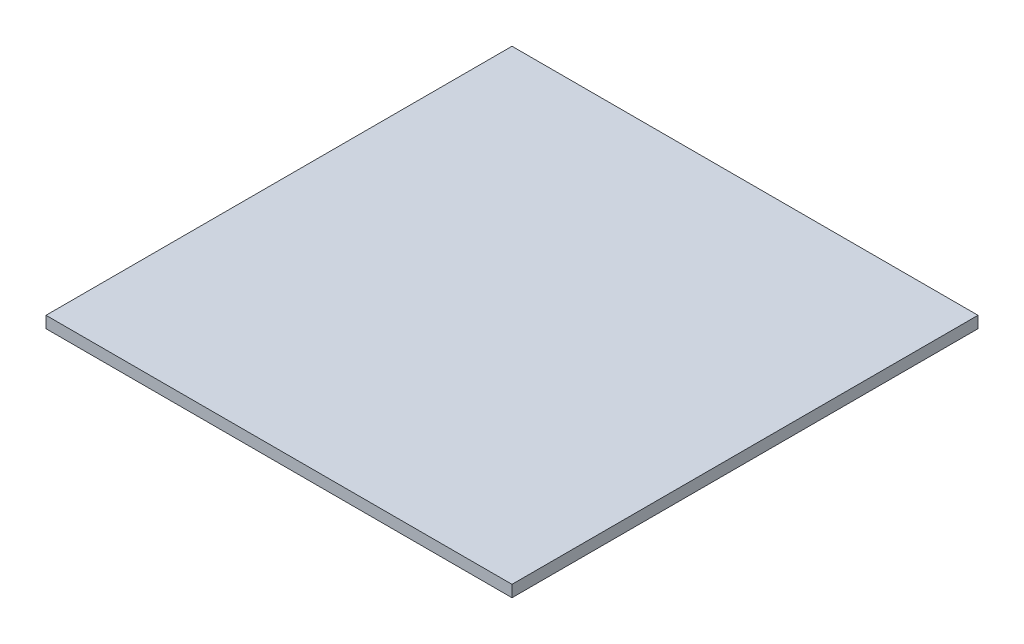
ISO-10303-21;
HEADER;
FILE_DESCRIPTION(('STEP AP214'),'2;1');
FILE_NAME('part.step','',(''),(''),'','','');
FILE_SCHEMA(('AUTOMOTIVE_DESIGN { 1 0 10303 214 1 1 1 1 }'));
ENDSEC;
DATA;
#1=APPLICATION_CONTEXT('core data for automotive mechanical design processes');
#2=APPLICATION_PROTOCOL_DEFINITION('international standard','automotive_design',2000,#1);
#3=PRODUCT_CONTEXT('',#1,'mechanical');
#4=PRODUCT('Part','Part','',(#3));
#5=PRODUCT_RELATED_PRODUCT_CATEGORY('part','',(#4));
#6=PRODUCT_DEFINITION_FORMATION('','',#4);
#7=PRODUCT_DEFINITION_CONTEXT('part definition',#1,'design');
#8=PRODUCT_DEFINITION('design','',#6,#7);
#9=PRODUCT_DEFINITION_SHAPE('','',#8);
#10=(LENGTH_UNIT() NAMED_UNIT(*) SI_UNIT(.MILLI.,.METRE.));
#11=(NAMED_UNIT(*) PLANE_ANGLE_UNIT() SI_UNIT($,.RADIAN.));
#12=(NAMED_UNIT(*) SI_UNIT($,.STERADIAN.) SOLID_ANGLE_UNIT());
#13=UNCERTAINTY_MEASURE_WITH_UNIT(LENGTH_MEASURE(1.E-05),#10,'distance_accuracy_value','');
#14=(GEOMETRIC_REPRESENTATION_CONTEXT(3) GLOBAL_UNCERTAINTY_ASSIGNED_CONTEXT((#13)) GLOBAL_UNIT_ASSIGNED_CONTEXT((#10,
#11,#12)) REPRESENTATION_CONTEXT('',''));
#15=CARTESIAN_POINT('',(0.,0.,0.));
#16=DIRECTION('',(0.,0.,1.));
#17=DIRECTION('',(1.,0.,0.));
#18=AXIS2_PLACEMENT_3D('',#15,#16,#17);
#19=CARTESIAN_POINT('',(500.,25.,500.));
#20=DIRECTION('',(-1.,0.,0.));
#21=DIRECTION('',(0.,0.,1.));
#22=AXIS2_PLACEMENT_3D('',#19,#20,#21);
#23=PLANE('',#22);
#24=DIRECTION('',(0.,0.,-1.));
#25=VECTOR('',#24,1.);
#26=CARTESIAN_POINT('',(500.,0.,500.));
#27=LINE('',#26,#25);
#28=CARTESIAN_POINT('',(500.,0.,500.));
#29=VERTEX_POINT('',#28);
#30=CARTESIAN_POINT('',(500.,0.,-500.));
#31=VERTEX_POINT('',#30);
#32=EDGE_CURVE('E100',#29,#31,#27,.T.);
#33=ORIENTED_EDGE('',*,*,#32,.T.);
#34=DIRECTION('',(0.,-1.,0.));
#35=VECTOR('',#34,1.);
#36=CARTESIAN_POINT('',(500.,25.,-500.));
#37=LINE('',#36,#35);
#38=CARTESIAN_POINT('',(500.,25.,-500.));
#39=VERTEX_POINT('',#38);
#40=EDGE_CURVE('E11',#39,#31,#37,.T.);
#41=ORIENTED_EDGE('',*,*,#40,.F.);
#42=DIRECTION('',(0.,0.,-1.));
#43=VECTOR('',#42,1.);
#44=CARTESIAN_POINT('',(500.,25.,500.));
#45=LINE('',#44,#43);
#46=CARTESIAN_POINT('',(500.,25.,500.));
#47=VERTEX_POINT('',#46);
#48=EDGE_CURVE('E88',#47,#39,#45,.T.);
#49=ORIENTED_EDGE('',*,*,#48,.F.);
#50=DIRECTION('',(0.,-1.,0.));
#51=VECTOR('',#50,1.);
#52=CARTESIAN_POINT('',(500.,25.,500.));
#53=LINE('',#52,#51);
#54=EDGE_CURVE('E96',#47,#29,#53,.T.);
#55=ORIENTED_EDGE('',*,*,#54,.T.);
#56=EDGE_LOOP('',(#33,#41,#49,#55));
#57=FACE_BOUND('',#56,.T.);
#58=ADVANCED_FACE('F37',(#57),#23,.F.);
#59=CARTESIAN_POINT('',(-500.,25.,-500.));
#60=DIRECTION('',(0.,0.,1.));
#61=DIRECTION('',(1.,0.,0.));
#62=AXIS2_PLACEMENT_3D('',#59,#60,#61);
#63=PLANE('',#62);
#64=DIRECTION('',(-1.,0.,0.));
#65=VECTOR('',#64,1.);
#66=CARTESIAN_POINT('',(-500.,0.,-500.));
#67=LINE('',#66,#65);
#68=CARTESIAN_POINT('',(-500.,0.,-500.));
#69=VERTEX_POINT('',#68);
#70=EDGE_CURVE('E92',#31,#69,#67,.T.);
#71=ORIENTED_EDGE('',*,*,#70,.T.);
#72=DIRECTION('',(0.,-1.,0.));
#73=VECTOR('',#72,1.);
#74=CARTESIAN_POINT('',(-500.,25.,-500.));
#75=LINE('',#74,#73);
#76=CARTESIAN_POINT('',(-500.,25.,-500.));
#77=VERTEX_POINT('',#76);
#78=EDGE_CURVE('E45',#77,#69,#75,.T.);
#79=ORIENTED_EDGE('',*,*,#78,.F.);
#80=DIRECTION('',(-1.,0.,0.));
#81=VECTOR('',#80,1.);
#82=CARTESIAN_POINT('',(-500.,25.,-500.));
#83=LINE('',#82,#81);
#84=EDGE_CURVE('E83',#39,#77,#83,.T.);
#85=ORIENTED_EDGE('',*,*,#84,.F.);
#86=ORIENTED_EDGE('',*,*,#40,.T.);
#87=EDGE_LOOP('',(#71,#79,#85,#86));
#88=FACE_BOUND('',#87,.T.);
#89=ADVANCED_FACE('F91',(#88),#63,.F.);
#90=CARTESIAN_POINT('',(-500.,25.,500.));
#91=DIRECTION('',(1.,0.,0.));
#92=DIRECTION('',(0.,0.,-1.));
#93=AXIS2_PLACEMENT_3D('',#90,#91,#92);
#94=PLANE('',#93);
#95=DIRECTION('',(0.,0.,1.));
#96=VECTOR('',#95,1.);
#97=CARTESIAN_POINT('',(-500.,0.,500.));
#98=LINE('',#97,#96);
#99=CARTESIAN_POINT('',(-500.,0.,500.));
#100=VERTEX_POINT('',#99);
#101=EDGE_CURVE('E70',#69,#100,#98,.T.);
#102=ORIENTED_EDGE('',*,*,#101,.T.);
#103=DIRECTION('',(0.,-1.,0.));
#104=VECTOR('',#103,1.);
#105=CARTESIAN_POINT('',(-500.,25.,500.));
#106=LINE('',#105,#104);
#107=CARTESIAN_POINT('',(-500.,25.,500.));
#108=VERTEX_POINT('',#107);
#109=EDGE_CURVE('E93',#108,#100,#106,.T.);
#110=ORIENTED_EDGE('',*,*,#109,.F.);
#111=DIRECTION('',(0.,0.,1.));
#112=VECTOR('',#111,1.);
#113=CARTESIAN_POINT('',(-500.,25.,500.));
#114=LINE('',#113,#112);
#115=EDGE_CURVE('E86',#77,#108,#114,.T.);
#116=ORIENTED_EDGE('',*,*,#115,.F.);
#117=ORIENTED_EDGE('',*,*,#78,.T.);
#118=EDGE_LOOP('',(#102,#110,#116,#117));
#119=FACE_BOUND('',#118,.T.);
#120=ADVANCED_FACE('F94',(#119),#94,.F.);
#121=CARTESIAN_POINT('',(-500.,25.,500.));
#122=DIRECTION('',(0.,0.,-1.));
#123=DIRECTION('',(-1.,0.,0.));
#124=AXIS2_PLACEMENT_3D('',#121,#122,#123);
#125=PLANE('',#124);
#126=DIRECTION('',(1.,0.,0.));
#127=VECTOR('',#126,1.);
#128=CARTESIAN_POINT('',(-500.,0.,500.));
#129=LINE('',#128,#127);
#130=EDGE_CURVE('E76',#100,#29,#129,.T.);
#131=ORIENTED_EDGE('',*,*,#130,.T.);
#132=ORIENTED_EDGE('',*,*,#54,.F.);
#133=DIRECTION('',(1.,0.,0.));
#134=VECTOR('',#133,1.);
#135=CARTESIAN_POINT('',(-500.,25.,500.));
#136=LINE('',#135,#134);
#137=EDGE_CURVE('E53',#108,#47,#136,.T.);
#138=ORIENTED_EDGE('',*,*,#137,.F.);
#139=ORIENTED_EDGE('',*,*,#109,.T.);
#140=EDGE_LOOP('',(#131,#132,#138,#139));
#141=FACE_BOUND('',#140,.T.);
#142=ADVANCED_FACE('F107',(#141),#125,.F.);
#143=CARTESIAN_POINT('',(0.,25.,0.));
#144=DIRECTION('',(0.,-1.,0.));
#145=DIRECTION('',(0.,0.,-1.));
#146=AXIS2_PLACEMENT_3D('',#143,#144,#145);
#147=PLANE('',#146);
#148=ORIENTED_EDGE('',*,*,#48,.T.);
#149=ORIENTED_EDGE('',*,*,#84,.T.);
#150=ORIENTED_EDGE('',*,*,#115,.T.);
#151=ORIENTED_EDGE('',*,*,#137,.T.);
#152=EDGE_LOOP('',(#148,#149,#150,#151));
#153=FACE_BOUND('',#152,.T.);
#154=ADVANCED_FACE('F84',(#153),#147,.F.);
#155=CARTESIAN_POINT('',(0.,0.,0.));
#156=DIRECTION('',(0.,-1.,0.));
#157=DIRECTION('',(0.,0.,-1.));
#158=AXIS2_PLACEMENT_3D('',#155,#156,#157);
#159=PLANE('',#158);
#160=ORIENTED_EDGE('',*,*,#32,.F.);
#161=ORIENTED_EDGE('',*,*,#130,.F.);
#162=ORIENTED_EDGE('',*,*,#101,.F.);
#163=ORIENTED_EDGE('',*,*,#70,.F.);
#164=EDGE_LOOP('',(#160,#161,#162,#163));
#165=FACE_BOUND('',#164,.T.);
#166=ADVANCED_FACE('F110',(#165),#159,.T.);
#167=CLOSED_SHELL('',(#58,#89,#120,#142,#154,#166));
#168=MANIFOLD_SOLID_BREP('B2',#167);
#169=ADVANCED_BREP_SHAPE_REPRESENTATION('',(#18,#168),#14);
#170=SHAPE_DEFINITION_REPRESENTATION(#9,#169);
ENDSEC;
END-ISO-10303-21;
